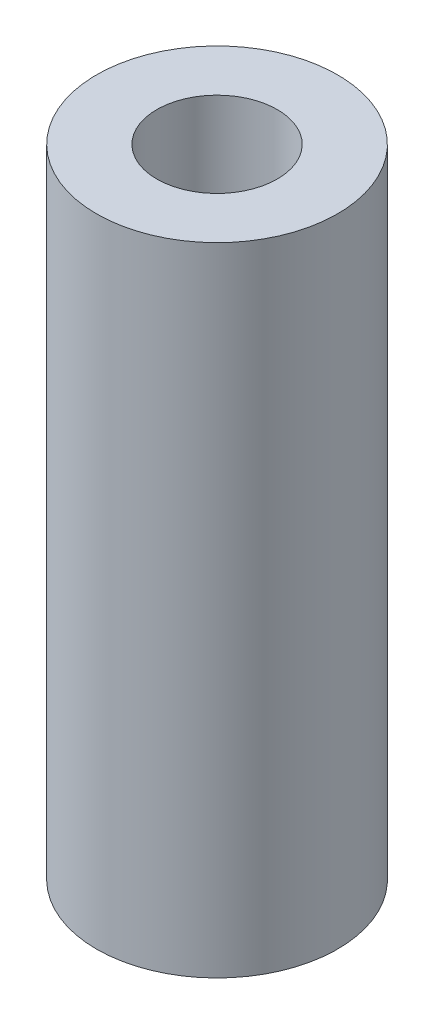
ISO-10303-21;
HEADER;
FILE_DESCRIPTION(('STEP AP214'),'2;1');
FILE_NAME('part.step','',(''),(''),'','','');
FILE_SCHEMA(('AUTOMOTIVE_DESIGN { 1 0 10303 214 1 1 1 1 }'));
ENDSEC;
DATA;
#1=APPLICATION_CONTEXT('core data for automotive mechanical design processes');
#2=APPLICATION_PROTOCOL_DEFINITION('international standard','automotive_design',2000,#1);
#3=PRODUCT_CONTEXT('',#1,'mechanical');
#4=PRODUCT('Part','Part','',(#3));
#5=PRODUCT_RELATED_PRODUCT_CATEGORY('part','',(#4));
#6=PRODUCT_DEFINITION_FORMATION('','',#4);
#7=PRODUCT_DEFINITION_CONTEXT('part definition',#1,'design');
#8=PRODUCT_DEFINITION('design','',#6,#7);
#9=PRODUCT_DEFINITION_SHAPE('','',#8);
#10=(LENGTH_UNIT() NAMED_UNIT(*) SI_UNIT(.MILLI.,.METRE.));
#11=(NAMED_UNIT(*) PLANE_ANGLE_UNIT() SI_UNIT($,.RADIAN.));
#12=(NAMED_UNIT(*) SI_UNIT($,.STERADIAN.) SOLID_ANGLE_UNIT());
#13=UNCERTAINTY_MEASURE_WITH_UNIT(LENGTH_MEASURE(1.E-05),#10,'distance_accuracy_value','');
#14=(GEOMETRIC_REPRESENTATION_CONTEXT(3) GLOBAL_UNCERTAINTY_ASSIGNED_CONTEXT((#13)) GLOBAL_UNIT_ASSIGNED_CONTEXT((#10,
#11,#12)) REPRESENTATION_CONTEXT('',''));
#15=CARTESIAN_POINT('',(0.,0.,0.));
#16=DIRECTION('',(0.,0.,1.));
#17=DIRECTION('',(1.,0.,0.));
#18=AXIS2_PLACEMENT_3D('',#15,#16,#17);
#19=CARTESIAN_POINT('',(0.,18.5,0.));
#20=DIRECTION('',(0.,1.,0.));
#21=DIRECTION('',(0.,0.,1.));
#22=AXIS2_PLACEMENT_3D('',#19,#20,#21);
#23=PLANE('',#22);
#24=CARTESIAN_POINT('',(0.,18.5,0.));
#25=DIRECTION('',(0.,1.,0.));
#26=DIRECTION('',(0.,0.,1.));
#27=AXIS2_PLACEMENT_3D('',#24,#25,#26);
#28=CIRCLE('',#27,3.5);
#29=CARTESIAN_POINT('',(0.,18.5,3.5));
#30=VERTEX_POINT('',#29);
#31=EDGE_CURVE('E10',#30,#30,#28,.T.);
#32=ORIENTED_EDGE('',*,*,#31,.T.);
#33=EDGE_LOOP('',(#32));
#34=FACE_BOUND('',#33,.T.);
#35=CARTESIAN_POINT('',(0.,18.5,0.));
#36=DIRECTION('',(0.,1.,0.));
#37=DIRECTION('',(0.,0.,1.));
#38=AXIS2_PLACEMENT_3D('',#35,#36,#37);
#39=CIRCLE('',#38,1.75);
#40=CARTESIAN_POINT('',(0.,18.5,1.75));
#41=VERTEX_POINT('',#40);
#42=EDGE_CURVE('E50',#41,#41,#39,.T.);
#43=ORIENTED_EDGE('',*,*,#42,.F.);
#44=EDGE_LOOP('',(#43));
#45=FACE_BOUND('',#44,.T.);
#46=ADVANCED_FACE('F37',(#34,#45),#23,.T.);
#47=CARTESIAN_POINT('',(0.,0.,0.));
#48=DIRECTION('',(0.,1.,0.));
#49=DIRECTION('',(0.,0.,1.));
#50=AXIS2_PLACEMENT_3D('',#47,#48,#49);
#51=PLANE('',#50);
#52=CARTESIAN_POINT('',(0.,0.,0.));
#53=DIRECTION('',(0.,1.,0.));
#54=DIRECTION('',(0.,0.,1.));
#55=AXIS2_PLACEMENT_3D('',#52,#53,#54);
#56=CIRCLE('',#55,3.5);
#57=CARTESIAN_POINT('',(0.,0.,3.5));
#58=VERTEX_POINT('',#57);
#59=EDGE_CURVE('E41',#58,#58,#56,.T.);
#60=ORIENTED_EDGE('',*,*,#59,.F.);
#61=EDGE_LOOP('',(#60));
#62=FACE_BOUND('',#61,.T.);
#63=CARTESIAN_POINT('',(0.,0.,0.));
#64=DIRECTION('',(0.,1.,0.));
#65=DIRECTION('',(0.,0.,1.));
#66=AXIS2_PLACEMENT_3D('',#63,#64,#65);
#67=CIRCLE('',#66,1.75);
#68=CARTESIAN_POINT('',(0.,0.,1.75));
#69=VERTEX_POINT('',#68);
#70=EDGE_CURVE('E52',#69,#69,#67,.T.);
#71=ORIENTED_EDGE('',*,*,#70,.T.);
#72=EDGE_LOOP('',(#71));
#73=FACE_BOUND('',#72,.T.);
#74=ADVANCED_FACE('F64',(#62,#73),#51,.F.);
#75=CARTESIAN_POINT('',(0.,18.5,0.));
#76=DIRECTION('',(0.,-1.,0.));
#77=DIRECTION('',(0.,0.,-1.));
#78=AXIS2_PLACEMENT_3D('',#75,#76,#77);
#79=CYLINDRICAL_SURFACE('',#78,3.5);
#80=ORIENTED_EDGE('',*,*,#31,.F.);
#81=EDGE_LOOP('',(#80));
#82=FACE_BOUND('',#81,.T.);
#83=ORIENTED_EDGE('',*,*,#59,.T.);
#84=EDGE_LOOP('',(#83));
#85=FACE_BOUND('',#84,.T.);
#86=ADVANCED_FACE('F39',(#82,#85),#79,.T.);
#87=CARTESIAN_POINT('',(0.,18.5,0.));
#88=DIRECTION('',(0.,-1.,0.));
#89=DIRECTION('',(0.,0.,-1.));
#90=AXIS2_PLACEMENT_3D('',#87,#88,#89);
#91=CYLINDRICAL_SURFACE('',#90,1.75);
#92=ORIENTED_EDGE('',*,*,#42,.T.);
#93=EDGE_LOOP('',(#92));
#94=FACE_BOUND('',#93,.T.);
#95=ORIENTED_EDGE('',*,*,#70,.F.);
#96=EDGE_LOOP('',(#95));
#97=FACE_BOUND('',#96,.T.);
#98=ADVANCED_FACE('F60',(#94,#97),#91,.F.);
#99=CLOSED_SHELL('',(#46,#74,#86,#98));
#100=MANIFOLD_SOLID_BREP('B2',#99);
#101=ADVANCED_BREP_SHAPE_REPRESENTATION('',(#18,#100),#14);
#102=SHAPE_DEFINITION_REPRESENTATION(#9,#101);
ENDSEC;
END-ISO-10303-21;
